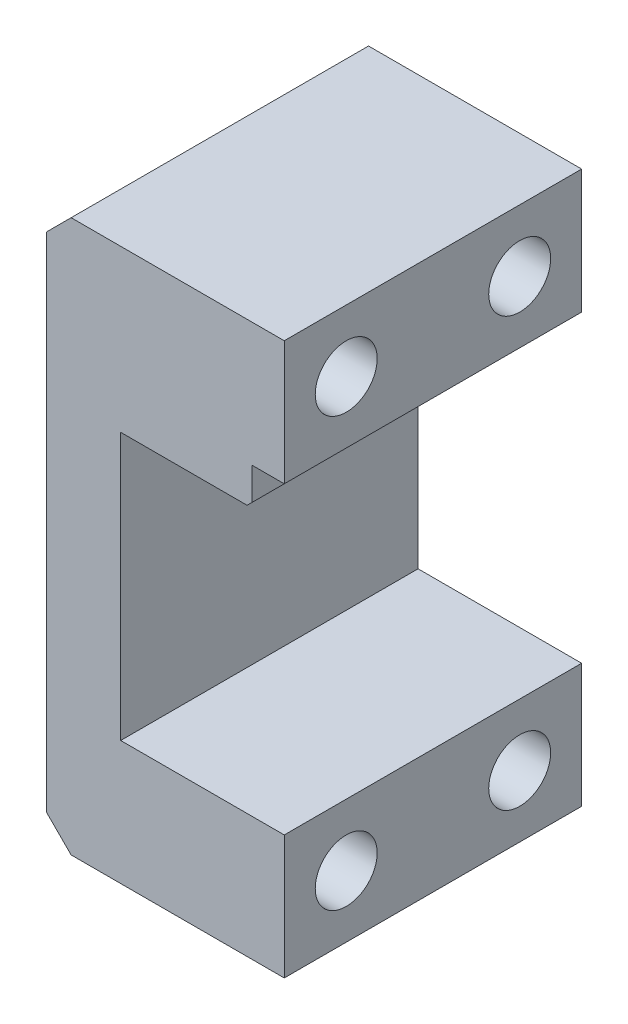
ISO-10303-21;
HEADER;
FILE_DESCRIPTION(('STEP AP214'),'2;1');
FILE_NAME('part.step','',(''),(''),'','','');
FILE_SCHEMA(('AUTOMOTIVE_DESIGN { 1 0 10303 214 1 1 1 1 }'));
ENDSEC;
DATA;
#1=APPLICATION_CONTEXT('core data for automotive mechanical design processes');
#2=APPLICATION_PROTOCOL_DEFINITION('international standard','automotive_design',2000,#1);
#3=PRODUCT_CONTEXT('',#1,'mechanical');
#4=PRODUCT('Part','Part','',(#3));
#5=PRODUCT_RELATED_PRODUCT_CATEGORY('part','',(#4));
#6=PRODUCT_DEFINITION_FORMATION('','',#4);
#7=PRODUCT_DEFINITION_CONTEXT('part definition',#1,'design');
#8=PRODUCT_DEFINITION('design','',#6,#7);
#9=PRODUCT_DEFINITION_SHAPE('','',#8);
#10=(LENGTH_UNIT() NAMED_UNIT(*) SI_UNIT(.MILLI.,.METRE.));
#11=(NAMED_UNIT(*) PLANE_ANGLE_UNIT() SI_UNIT($,.RADIAN.));
#12=(NAMED_UNIT(*) SI_UNIT($,.STERADIAN.) SOLID_ANGLE_UNIT());
#13=UNCERTAINTY_MEASURE_WITH_UNIT(LENGTH_MEASURE(1.E-05),#10,'distance_accuracy_value','');
#14=(GEOMETRIC_REPRESENTATION_CONTEXT(3) GLOBAL_UNCERTAINTY_ASSIGNED_CONTEXT((#13)) GLOBAL_UNIT_ASSIGNED_CONTEXT((#10,
#11,#12)) REPRESENTATION_CONTEXT('',''));
#15=CARTESIAN_POINT('',(0.,0.,0.));
#16=DIRECTION('',(0.,0.,1.));
#17=DIRECTION('',(1.,0.,0.));
#18=AXIS2_PLACEMENT_3D('',#15,#16,#17);
#19=CARTESIAN_POINT('',(9.6,0.,12.));
#20=DIRECTION('',(0.,1.,0.));
#21=DIRECTION('',(-1.,0.,0.));
#22=AXIS2_PLACEMENT_3D('',#19,#20,#21);
#23=PLANE('',#22);
#24=DIRECTION('',(1.,0.,0.));
#25=VECTOR('',#24,1.);
#26=CARTESIAN_POINT('',(9.6,0.,12.));
#27=LINE('',#26,#25);
#28=CARTESIAN_POINT('',(1.,0.,12.));
#29=VERTEX_POINT('',#28);
#30=CARTESIAN_POINT('',(9.6,0.,12.));
#31=VERTEX_POINT('',#30);
#32=EDGE_CURVE('E132',#29,#31,#27,.T.);
#33=ORIENTED_EDGE('',*,*,#32,.F.);
#34=DIRECTION('',(0.,0.,-1.));
#35=VECTOR('',#34,1.);
#36=CARTESIAN_POINT('',(1.,0.,12.));
#37=LINE('',#36,#35);
#38=CARTESIAN_POINT('',(1.,0.,0.));
#39=VERTEX_POINT('',#38);
#40=EDGE_CURVE('E170',#29,#39,#37,.T.);
#41=ORIENTED_EDGE('',*,*,#40,.T.);
#42=DIRECTION('',(1.,0.,0.));
#43=VECTOR('',#42,1.);
#44=CARTESIAN_POINT('',(9.6,0.,0.));
#45=LINE('',#44,#43);
#46=CARTESIAN_POINT('',(9.6,0.,0.));
#47=VERTEX_POINT('',#46);
#48=EDGE_CURVE('E154',#39,#47,#45,.T.);
#49=ORIENTED_EDGE('',*,*,#48,.T.);
#50=DIRECTION('',(0.,0.,-1.));
#51=VECTOR('',#50,1.);
#52=CARTESIAN_POINT('',(9.6,0.,12.));
#53=LINE('',#52,#51);
#54=EDGE_CURVE('E147',#31,#47,#53,.T.);
#55=ORIENTED_EDGE('',*,*,#54,.F.);
#56=EDGE_LOOP('',(#33,#41,#49,#55));
#57=FACE_BOUND('',#56,.T.);
#58=ADVANCED_FACE('F36',(#57),#23,.F.);
#59=CARTESIAN_POINT('',(9.6,5.,12.));
#60=DIRECTION('',(-1.,0.,0.));
#61=DIRECTION('',(0.,0.,1.));
#62=AXIS2_PLACEMENT_3D('',#59,#60,#61);
#63=PLANE('',#62);
#64=CARTESIAN_POINT('',(9.6,2.5,2.50000000000001));
#65=DIRECTION('',(-1.,0.,0.));
#66=DIRECTION('',(0.,0.,1.));
#67=AXIS2_PLACEMENT_3D('',#64,#65,#66);
#68=CIRCLE('',#67,1.25);
#69=CARTESIAN_POINT('',(9.6,2.5,3.75));
#70=VERTEX_POINT('',#69);
#71=EDGE_CURVE('E329',#70,#70,#68,.T.);
#72=ORIENTED_EDGE('',*,*,#71,.T.);
#73=EDGE_LOOP('',(#72));
#74=FACE_BOUND('',#73,.T.);
#75=CARTESIAN_POINT('',(9.6,2.5,9.5));
#76=DIRECTION('',(-1.,0.,0.));
#77=DIRECTION('',(0.,0.,1.));
#78=AXIS2_PLACEMENT_3D('',#75,#76,#77);
#79=CIRCLE('',#78,1.25);
#80=CARTESIAN_POINT('',(9.6,2.5,10.75));
#81=VERTEX_POINT('',#80);
#82=EDGE_CURVE('E339',#81,#81,#79,.T.);
#83=ORIENTED_EDGE('',*,*,#82,.T.);
#84=EDGE_LOOP('',(#83));
#85=FACE_BOUND('',#84,.T.);
#86=DIRECTION('',(0.,1.,0.));
#87=VECTOR('',#86,1.);
#88=CARTESIAN_POINT('',(9.6,5.,0.));
#89=LINE('',#88,#87);
#90=CARTESIAN_POINT('',(9.6,5.,0.));
#91=VERTEX_POINT('',#90);
#92=EDGE_CURVE('E232',#47,#91,#89,.T.);
#93=ORIENTED_EDGE('',*,*,#92,.T.);
#94=DIRECTION('',(0.,0.,-1.));
#95=VECTOR('',#94,1.);
#96=CARTESIAN_POINT('',(9.6,5.,12.));
#97=LINE('',#96,#95);
#98=CARTESIAN_POINT('',(9.6,5.,12.));
#99=VERTEX_POINT('',#98);
#100=EDGE_CURVE('E149',#99,#91,#97,.T.);
#101=ORIENTED_EDGE('',*,*,#100,.F.);
#102=DIRECTION('',(0.,1.,0.));
#103=VECTOR('',#102,1.);
#104=CARTESIAN_POINT('',(9.6,5.,12.));
#105=LINE('',#104,#103);
#106=EDGE_CURVE('E135',#31,#99,#105,.T.);
#107=ORIENTED_EDGE('',*,*,#106,.F.);
#108=ORIENTED_EDGE('',*,*,#54,.T.);
#109=EDGE_LOOP('',(#93,#101,#107,#108));
#110=FACE_BOUND('',#109,.T.);
#111=ADVANCED_FACE('F146',(#74,#85,#110),#63,.F.);
#112=CARTESIAN_POINT('',(3.,5.,12.));
#113=DIRECTION('',(0.,-1.,0.));
#114=DIRECTION('',(1.,0.,0.));
#115=AXIS2_PLACEMENT_3D('',#112,#113,#114);
#116=PLANE('',#115);
#117=DIRECTION('',(-1.,0.,0.));
#118=VECTOR('',#117,1.);
#119=CARTESIAN_POINT('',(3.,5.,0.));
#120=LINE('',#119,#118);
#121=CARTESIAN_POINT('',(3.,5.,0.));
#122=VERTEX_POINT('',#121);
#123=EDGE_CURVE('E226',#91,#122,#120,.T.);
#124=ORIENTED_EDGE('',*,*,#123,.T.);
#125=DIRECTION('',(0.,0.,-1.));
#126=VECTOR('',#125,1.);
#127=CARTESIAN_POINT('',(3.,5.,12.));
#128=LINE('',#127,#126);
#129=CARTESIAN_POINT('',(3.,5.,12.));
#130=VERTEX_POINT('',#129);
#131=EDGE_CURVE('E161',#130,#122,#128,.T.);
#132=ORIENTED_EDGE('',*,*,#131,.F.);
#133=DIRECTION('',(-1.,0.,0.));
#134=VECTOR('',#133,1.);
#135=CARTESIAN_POINT('',(3.,5.,12.));
#136=LINE('',#135,#134);
#137=EDGE_CURVE('E151',#99,#130,#136,.T.);
#138=ORIENTED_EDGE('',*,*,#137,.F.);
#139=ORIENTED_EDGE('',*,*,#100,.T.);
#140=EDGE_LOOP('',(#124,#132,#138,#139));
#141=FACE_BOUND('',#140,.T.);
#142=ADVANCED_FACE('F255',(#141),#116,.F.);
#143=CARTESIAN_POINT('',(3.,15.77,12.));
#144=DIRECTION('',(-1.,0.,0.));
#145=DIRECTION('',(0.,-1.,0.));
#146=AXIS2_PLACEMENT_3D('',#143,#144,#145);
#147=PLANE('',#146);
#148=DIRECTION('',(0.,1.,0.));
#149=VECTOR('',#148,1.);
#150=CARTESIAN_POINT('',(3.,15.77,0.));
#151=LINE('',#150,#149);
#152=CARTESIAN_POINT('',(3.,15.77,0.));
#153=VERTEX_POINT('',#152);
#154=EDGE_CURVE('E221',#122,#153,#151,.T.);
#155=ORIENTED_EDGE('',*,*,#154,.T.);
#156=DIRECTION('',(0.,0.,-1.));
#157=VECTOR('',#156,1.);
#158=CARTESIAN_POINT('',(3.,15.77,12.));
#159=LINE('',#158,#157);
#160=CARTESIAN_POINT('',(3.,15.77,12.));
#161=VERTEX_POINT('',#160);
#162=EDGE_CURVE('E212',#161,#153,#159,.T.);
#163=ORIENTED_EDGE('',*,*,#162,.F.);
#164=DIRECTION('',(0.,1.,0.));
#165=VECTOR('',#164,1.);
#166=CARTESIAN_POINT('',(3.,15.77,12.));
#167=LINE('',#166,#165);
#168=EDGE_CURVE('E222',#130,#161,#167,.T.);
#169=ORIENTED_EDGE('',*,*,#168,.F.);
#170=ORIENTED_EDGE('',*,*,#131,.T.);
#171=EDGE_LOOP('',(#155,#163,#169,#170));
#172=FACE_BOUND('',#171,.T.);
#173=ADVANCED_FACE('F219',(#172),#147,.F.);
#174=CARTESIAN_POINT('',(8.3,15.77,12.));
#175=DIRECTION('',(0.,1.,0.));
#176=DIRECTION('',(0.,0.,1.));
#177=AXIS2_PLACEMENT_3D('',#174,#175,#176);
#178=PLANE('',#177);
#179=DIRECTION('',(1.,0.,0.));
#180=VECTOR('',#179,1.);
#181=CARTESIAN_POINT('',(8.3,15.77,0.));
#182=LINE('',#181,#180);
#183=CARTESIAN_POINT('',(8.1,15.77,0.));
#184=VERTEX_POINT('',#183);
#185=EDGE_CURVE('E228',#153,#184,#182,.T.);
#186=ORIENTED_EDGE('',*,*,#185,.T.);
#187=DIRECTION('',(0.,0.,1.));
#188=VECTOR('',#187,1.);
#189=CARTESIAN_POINT('',(8.1,15.77,12.));
#190=LINE('',#189,#188);
#191=CARTESIAN_POINT('',(8.1,15.77,12.));
#192=VERTEX_POINT('',#191);
#193=EDGE_CURVE('E166',#184,#192,#190,.T.);
#194=ORIENTED_EDGE('',*,*,#193,.T.);
#195=DIRECTION('',(1.,0.,0.));
#196=VECTOR('',#195,1.);
#197=CARTESIAN_POINT('',(8.3,15.77,12.));
#198=LINE('',#197,#196);
#199=EDGE_CURVE('E257',#161,#192,#198,.T.);
#200=ORIENTED_EDGE('',*,*,#199,.F.);
#201=ORIENTED_EDGE('',*,*,#162,.T.);
#202=EDGE_LOOP('',(#186,#194,#200,#201));
#203=FACE_BOUND('',#202,.T.);
#204=ADVANCED_FACE('F269',(#203),#178,.F.);
#205=CARTESIAN_POINT('',(8.3,17.27,12.));
#206=DIRECTION('',(-1.,0.,0.));
#207=DIRECTION('',(0.,-1.,0.));
#208=AXIS2_PLACEMENT_3D('',#205,#206,#207);
#209=PLANE('',#208);
#210=DIRECTION('',(0.,1.,0.));
#211=VECTOR('',#210,1.);
#212=CARTESIAN_POINT('',(8.3,17.27,12.));
#213=LINE('',#212,#211);
#214=CARTESIAN_POINT('',(8.3,15.97,12.));
#215=VERTEX_POINT('',#214);
#216=CARTESIAN_POINT('',(8.3,17.27,12.));
#217=VERTEX_POINT('',#216);
#218=EDGE_CURVE('E250',#215,#217,#213,.T.);
#219=ORIENTED_EDGE('',*,*,#218,.F.);
#220=DIRECTION('',(0.,0.,-1.));
#221=VECTOR('',#220,1.);
#222=CARTESIAN_POINT('',(8.3,15.97,12.));
#223=LINE('',#222,#221);
#224=CARTESIAN_POINT('',(8.3,15.97,0.));
#225=VERTEX_POINT('',#224);
#226=EDGE_CURVE('E156',#215,#225,#223,.T.);
#227=ORIENTED_EDGE('',*,*,#226,.T.);
#228=DIRECTION('',(0.,1.,0.));
#229=VECTOR('',#228,1.);
#230=CARTESIAN_POINT('',(8.3,17.27,0.));
#231=LINE('',#230,#229);
#232=CARTESIAN_POINT('',(8.3,17.27,0.));
#233=VERTEX_POINT('',#232);
#234=EDGE_CURVE('E230',#225,#233,#231,.T.);
#235=ORIENTED_EDGE('',*,*,#234,.T.);
#236=DIRECTION('',(0.,0.,-1.));
#237=VECTOR('',#236,1.);
#238=CARTESIAN_POINT('',(8.3,17.27,12.));
#239=LINE('',#238,#237);
#240=EDGE_CURVE('E209',#217,#233,#239,.T.);
#241=ORIENTED_EDGE('',*,*,#240,.F.);
#242=EDGE_LOOP('',(#219,#227,#235,#241));
#243=FACE_BOUND('',#242,.T.);
#244=ADVANCED_FACE('F265',(#243),#209,.F.);
#245=CARTESIAN_POINT('',(9.6,17.27,12.));
#246=DIRECTION('',(0.,1.,0.));
#247=DIRECTION('',(0.,0.,1.));
#248=AXIS2_PLACEMENT_3D('',#245,#246,#247);
#249=PLANE('',#248);
#250=DIRECTION('',(1.,0.,0.));
#251=VECTOR('',#250,1.);
#252=CARTESIAN_POINT('',(9.6,17.27,0.));
#253=LINE('',#252,#251);
#254=CARTESIAN_POINT('',(9.6,17.27,0.));
#255=VERTEX_POINT('',#254);
#256=EDGE_CURVE('E201',#233,#255,#253,.T.);
#257=ORIENTED_EDGE('',*,*,#256,.T.);
#258=DIRECTION('',(0.,0.,-1.));
#259=VECTOR('',#258,1.);
#260=CARTESIAN_POINT('',(9.6,17.27,12.));
#261=LINE('',#260,#259);
#262=CARTESIAN_POINT('',(9.6,17.27,12.));
#263=VERTEX_POINT('',#262);
#264=EDGE_CURVE('E206',#263,#255,#261,.T.);
#265=ORIENTED_EDGE('',*,*,#264,.F.);
#266=DIRECTION('',(1.,0.,0.));
#267=VECTOR('',#266,1.);
#268=CARTESIAN_POINT('',(9.6,17.27,12.));
#269=LINE('',#268,#267);
#270=EDGE_CURVE('E247',#217,#263,#269,.T.);
#271=ORIENTED_EDGE('',*,*,#270,.F.);
#272=ORIENTED_EDGE('',*,*,#240,.T.);
#273=EDGE_LOOP('',(#257,#265,#271,#272));
#274=FACE_BOUND('',#273,.T.);
#275=ADVANCED_FACE('F239',(#274),#249,.F.);
#276=CARTESIAN_POINT('',(9.6,22.27,12.));
#277=DIRECTION('',(-1.,0.,0.));
#278=DIRECTION('',(0.,-1.,0.));
#279=AXIS2_PLACEMENT_3D('',#276,#277,#278);
#280=PLANE('',#279);
#281=CARTESIAN_POINT('',(9.6,19.77,9.5));
#282=DIRECTION('',(-1.,0.,0.));
#283=DIRECTION('',(0.,0.,1.));
#284=AXIS2_PLACEMENT_3D('',#281,#282,#283);
#285=CIRCLE('',#284,1.25);
#286=CARTESIAN_POINT('',(9.6,19.77,10.75));
#287=VERTEX_POINT('',#286);
#288=EDGE_CURVE('E345',#287,#287,#285,.T.);
#289=ORIENTED_EDGE('',*,*,#288,.T.);
#290=EDGE_LOOP('',(#289));
#291=FACE_BOUND('',#290,.T.);
#292=CARTESIAN_POINT('',(9.6,19.77,2.5));
#293=DIRECTION('',(-1.,0.,0.));
#294=DIRECTION('',(0.,0.,1.));
#295=AXIS2_PLACEMENT_3D('',#292,#293,#294);
#296=CIRCLE('',#295,1.25);
#297=CARTESIAN_POINT('',(9.6,19.77,3.75));
#298=VERTEX_POINT('',#297);
#299=EDGE_CURVE('E254',#298,#298,#296,.T.);
#300=ORIENTED_EDGE('',*,*,#299,.T.);
#301=EDGE_LOOP('',(#300));
#302=FACE_BOUND('',#301,.T.);
#303=DIRECTION('',(0.,1.,0.));
#304=VECTOR('',#303,1.);
#305=CARTESIAN_POINT('',(9.6,22.27,0.));
#306=LINE('',#305,#304);
#307=CARTESIAN_POINT('',(9.6,22.27,0.));
#308=VERTEX_POINT('',#307);
#309=EDGE_CURVE('E198',#255,#308,#306,.T.);
#310=ORIENTED_EDGE('',*,*,#309,.T.);
#311=DIRECTION('',(0.,0.,-1.));
#312=VECTOR('',#311,1.);
#313=CARTESIAN_POINT('',(9.6,22.27,12.));
#314=LINE('',#313,#312);
#315=CARTESIAN_POINT('',(9.6,22.27,12.));
#316=VERTEX_POINT('',#315);
#317=EDGE_CURVE('E188',#316,#308,#314,.T.);
#318=ORIENTED_EDGE('',*,*,#317,.F.);
#319=DIRECTION('',(0.,1.,0.));
#320=VECTOR('',#319,1.);
#321=CARTESIAN_POINT('',(9.6,22.27,12.));
#322=LINE('',#321,#320);
#323=EDGE_CURVE('E246',#263,#316,#322,.T.);
#324=ORIENTED_EDGE('',*,*,#323,.F.);
#325=ORIENTED_EDGE('',*,*,#264,.T.);
#326=EDGE_LOOP('',(#310,#318,#324,#325));
#327=FACE_BOUND('',#326,.T.);
#328=ADVANCED_FACE('F245',(#291,#302,#327),#280,.F.);
#329=CARTESIAN_POINT('',(0.,22.27,12.));
#330=DIRECTION('',(0.,-1.,0.));
#331=DIRECTION('',(0.,0.,-1.));
#332=AXIS2_PLACEMENT_3D('',#329,#330,#331);
#333=PLANE('',#332);
#334=DIRECTION('',(-1.,0.,0.));
#335=VECTOR('',#334,1.);
#336=CARTESIAN_POINT('',(0.,22.27,0.));
#337=LINE('',#336,#335);
#338=CARTESIAN_POINT('',(1.,22.27,0.));
#339=VERTEX_POINT('',#338);
#340=EDGE_CURVE('E194',#308,#339,#337,.T.);
#341=ORIENTED_EDGE('',*,*,#340,.T.);
#342=DIRECTION('',(0.,0.,1.));
#343=VECTOR('',#342,1.);
#344=CARTESIAN_POINT('',(1.,22.27,12.));
#345=LINE('',#344,#343);
#346=CARTESIAN_POINT('',(1.,22.27,12.));
#347=VERTEX_POINT('',#346);
#348=EDGE_CURVE('E11',#339,#347,#345,.T.);
#349=ORIENTED_EDGE('',*,*,#348,.T.);
#350=DIRECTION('',(-1.,0.,0.));
#351=VECTOR('',#350,1.);
#352=CARTESIAN_POINT('',(0.,22.27,12.));
#353=LINE('',#352,#351);
#354=EDGE_CURVE('E183',#316,#347,#353,.T.);
#355=ORIENTED_EDGE('',*,*,#354,.F.);
#356=ORIENTED_EDGE('',*,*,#317,.T.);
#357=EDGE_LOOP('',(#341,#349,#355,#356));
#358=FACE_BOUND('',#357,.T.);
#359=ADVANCED_FACE('F196',(#358),#333,.F.);
#360=CARTESIAN_POINT('',(0.,0.,12.));
#361=DIRECTION('',(1.,0.,0.));
#362=DIRECTION('',(0.,0.,-1.));
#363=AXIS2_PLACEMENT_3D('',#360,#361,#362);
#364=PLANE('',#363);
#365=CARTESIAN_POINT('',(0.,2.5,2.50000000000001));
#366=DIRECTION('',(-1.,0.,0.));
#367=DIRECTION('',(0.,0.,1.));
#368=AXIS2_PLACEMENT_3D('',#365,#366,#367);
#369=CIRCLE('',#368,1.25);
#370=CARTESIAN_POINT('',(0.,2.5,3.75000000000001));
#371=VERTEX_POINT('',#370);
#372=EDGE_CURVE('E332',#371,#371,#369,.T.);
#373=ORIENTED_EDGE('',*,*,#372,.F.);
#374=EDGE_LOOP('',(#373));
#375=FACE_BOUND('',#374,.T.);
#376=CARTESIAN_POINT('',(0.,2.5,9.5));
#377=DIRECTION('',(-1.,0.,0.));
#378=DIRECTION('',(0.,0.,1.));
#379=AXIS2_PLACEMENT_3D('',#376,#377,#378);
#380=CIRCLE('',#379,1.25);
#381=CARTESIAN_POINT('',(0.,2.5,10.75));
#382=VERTEX_POINT('',#381);
#383=EDGE_CURVE('E334',#382,#382,#380,.T.);
#384=ORIENTED_EDGE('',*,*,#383,.F.);
#385=EDGE_LOOP('',(#384));
#386=FACE_BOUND('',#385,.T.);
#387=CARTESIAN_POINT('',(0.,19.77,9.5));
#388=DIRECTION('',(-1.,0.,0.));
#389=DIRECTION('',(0.,0.,1.));
#390=AXIS2_PLACEMENT_3D('',#387,#388,#389);
#391=CIRCLE('',#390,1.25);
#392=CARTESIAN_POINT('',(0.,19.77,10.75));
#393=VERTEX_POINT('',#392);
#394=EDGE_CURVE('E342',#393,#393,#391,.T.);
#395=ORIENTED_EDGE('',*,*,#394,.F.);
#396=EDGE_LOOP('',(#395));
#397=FACE_BOUND('',#396,.T.);
#398=CARTESIAN_POINT('',(0.,19.77,2.5));
#399=DIRECTION('',(-1.,0.,0.));
#400=DIRECTION('',(0.,0.,1.));
#401=AXIS2_PLACEMENT_3D('',#398,#399,#400);
#402=CIRCLE('',#401,1.25);
#403=CARTESIAN_POINT('',(0.,19.77,3.75));
#404=VERTEX_POINT('',#403);
#405=EDGE_CURVE('E348',#404,#404,#402,.T.);
#406=ORIENTED_EDGE('',*,*,#405,.F.);
#407=EDGE_LOOP('',(#406));
#408=FACE_BOUND('',#407,.T.);
#409=DIRECTION('',(0.,-1.,0.));
#410=VECTOR('',#409,1.);
#411=CARTESIAN_POINT('',(0.,0.,0.));
#412=LINE('',#411,#410);
#413=CARTESIAN_POINT('',(0.,21.27,0.));
#414=VERTEX_POINT('',#413);
#415=CARTESIAN_POINT('',(0.,1.,0.));
#416=VERTEX_POINT('',#415);
#417=EDGE_CURVE('E142',#414,#416,#412,.T.);
#418=ORIENTED_EDGE('',*,*,#417,.T.);
#419=DIRECTION('',(0.,0.,1.));
#420=VECTOR('',#419,1.);
#421=CARTESIAN_POINT('',(0.,1.,12.));
#422=LINE('',#421,#420);
#423=CARTESIAN_POINT('',(0.,1.,12.));
#424=VERTEX_POINT('',#423);
#425=EDGE_CURVE('E57',#416,#424,#422,.T.);
#426=ORIENTED_EDGE('',*,*,#425,.T.);
#427=DIRECTION('',(0.,-1.,0.));
#428=VECTOR('',#427,1.);
#429=CARTESIAN_POINT('',(0.,0.,12.));
#430=LINE('',#429,#428);
#431=CARTESIAN_POINT('',(0.,21.27,12.));
#432=VERTEX_POINT('',#431);
#433=EDGE_CURVE('E182',#432,#424,#430,.T.);
#434=ORIENTED_EDGE('',*,*,#433,.F.);
#435=DIRECTION('',(0.,0.,-1.));
#436=VECTOR('',#435,1.);
#437=CARTESIAN_POINT('',(0.,21.27,12.));
#438=LINE('',#437,#436);
#439=EDGE_CURVE('E176',#432,#414,#438,.T.);
#440=ORIENTED_EDGE('',*,*,#439,.T.);
#441=EDGE_LOOP('',(#418,#426,#434,#440));
#442=FACE_BOUND('',#441,.T.);
#443=ADVANCED_FACE('F186',(#375,#386,#397,#408,#442),#364,.F.);
#444=CARTESIAN_POINT('',(0.,0.,12.));
#445=DIRECTION('',(0.,0.,-1.));
#446=DIRECTION('',(-1.,0.,0.));
#447=AXIS2_PLACEMENT_3D('',#444,#445,#446);
#448=PLANE('',#447);
#449=ORIENTED_EDGE('',*,*,#433,.T.);
#450=DIRECTION('',(-0.707106781186546,0.707106781186549,0.));
#451=VECTOR('',#450,1.);
#452=CARTESIAN_POINT('',(1.,0.,12.));
#453=LINE('',#452,#451);
#454=EDGE_CURVE('E44',#424,#29,#453,.F.);
#455=ORIENTED_EDGE('',*,*,#454,.T.);
#456=ORIENTED_EDGE('',*,*,#32,.T.);
#457=ORIENTED_EDGE('',*,*,#106,.T.);
#458=ORIENTED_EDGE('',*,*,#137,.T.);
#459=ORIENTED_EDGE('',*,*,#168,.T.);
#460=ORIENTED_EDGE('',*,*,#199,.T.);
#461=DIRECTION('',(-0.707106781186548,-0.707106781186548,0.));
#462=VECTOR('',#461,1.);
#463=CARTESIAN_POINT('',(8.3,15.97,12.));
#464=LINE('',#463,#462);
#465=EDGE_CURVE('E168',#192,#215,#464,.F.);
#466=ORIENTED_EDGE('',*,*,#465,.T.);
#467=ORIENTED_EDGE('',*,*,#218,.T.);
#468=ORIENTED_EDGE('',*,*,#270,.T.);
#469=ORIENTED_EDGE('',*,*,#323,.T.);
#470=ORIENTED_EDGE('',*,*,#354,.T.);
#471=DIRECTION('',(0.707106781186549,0.707106781186546,0.));
#472=VECTOR('',#471,1.);
#473=CARTESIAN_POINT('',(0.,21.27,12.));
#474=LINE('',#473,#472);
#475=EDGE_CURVE('E180',#347,#432,#474,.F.);
#476=ORIENTED_EDGE('',*,*,#475,.T.);
#477=EDGE_LOOP('',(#449,#455,#456,#457,#458,#459,#460,#466,#467,#468,#469,#470,#476));
#478=FACE_BOUND('',#477,.T.);
#479=ADVANCED_FACE('F134',(#478),#448,.F.);
#480=CARTESIAN_POINT('',(0.,0.,0.));
#481=DIRECTION('',(0.,0.,-1.));
#482=DIRECTION('',(-1.,0.,0.));
#483=AXIS2_PLACEMENT_3D('',#480,#481,#482);
#484=PLANE('',#483);
#485=ORIENTED_EDGE('',*,*,#48,.F.);
#486=DIRECTION('',(0.707106781186546,-0.707106781186549,0.));
#487=VECTOR('',#486,1.);
#488=CARTESIAN_POINT('',(0.500000000000002,0.500000000000001,0.));
#489=LINE('',#488,#487);
#490=EDGE_CURVE('E174',#39,#416,#489,.F.);
#491=ORIENTED_EDGE('',*,*,#490,.T.);
#492=ORIENTED_EDGE('',*,*,#417,.F.);
#493=DIRECTION('',(-0.707106781186549,-0.707106781186546,0.));
#494=VECTOR('',#493,1.);
#495=CARTESIAN_POINT('',(-10.635,10.635,0.));
#496=LINE('',#495,#494);
#497=EDGE_CURVE('E172',#414,#339,#496,.F.);
#498=ORIENTED_EDGE('',*,*,#497,.T.);
#499=ORIENTED_EDGE('',*,*,#340,.F.);
#500=ORIENTED_EDGE('',*,*,#309,.F.);
#501=ORIENTED_EDGE('',*,*,#256,.F.);
#502=ORIENTED_EDGE('',*,*,#234,.F.);
#503=DIRECTION('',(0.707106781186548,0.707106781186548,0.));
#504=VECTOR('',#503,1.);
#505=CARTESIAN_POINT('',(-3.835,3.835,0.));
#506=LINE('',#505,#504);
#507=EDGE_CURVE('E159',#225,#184,#506,.F.);
#508=ORIENTED_EDGE('',*,*,#507,.T.);
#509=ORIENTED_EDGE('',*,*,#185,.F.);
#510=ORIENTED_EDGE('',*,*,#154,.F.);
#511=ORIENTED_EDGE('',*,*,#123,.F.);
#512=ORIENTED_EDGE('',*,*,#92,.F.);
#513=EDGE_LOOP('',(#485,#491,#492,#498,#499,#500,#501,#502,#508,#509,#510,#511,#512));
#514=FACE_BOUND('',#513,.T.);
#515=ADVANCED_FACE('F192',(#514),#484,.T.);
#516=CARTESIAN_POINT('',(8.3,15.97,12.));
#517=DIRECTION('',(-0.707106781186548,0.707106781186548,0.));
#518=DIRECTION('',(0.,0.,-1.));
#519=AXIS2_PLACEMENT_3D('',#516,#517,#518);
#520=PLANE('',#519);
#521=ORIENTED_EDGE('',*,*,#465,.F.);
#522=ORIENTED_EDGE('',*,*,#193,.F.);
#523=ORIENTED_EDGE('',*,*,#507,.F.);
#524=ORIENTED_EDGE('',*,*,#226,.F.);
#525=EDGE_LOOP('',(#521,#522,#523,#524));
#526=FACE_BOUND('',#525,.T.);
#527=ADVANCED_FACE('F271',(#526),#520,.F.);
#528=CARTESIAN_POINT('',(0.,19.77,2.5));
#529=DIRECTION('',(-1.,0.,0.));
#530=DIRECTION('',(0.,0.,1.));
#531=AXIS2_PLACEMENT_3D('',#528,#529,#530);
#532=CYLINDRICAL_SURFACE('',#531,1.25);
#533=ORIENTED_EDGE('',*,*,#299,.F.);
#534=EDGE_LOOP('',(#533));
#535=FACE_BOUND('',#534,.T.);
#536=ORIENTED_EDGE('',*,*,#405,.T.);
#537=EDGE_LOOP('',(#536));
#538=FACE_BOUND('',#537,.T.);
#539=ADVANCED_FACE('F273',(#535,#538),#532,.F.);
#540=CARTESIAN_POINT('',(0.,19.77,9.5));
#541=DIRECTION('',(-1.,0.,0.));
#542=DIRECTION('',(0.,0.,1.));
#543=AXIS2_PLACEMENT_3D('',#540,#541,#542);
#544=CYLINDRICAL_SURFACE('',#543,1.25);
#545=ORIENTED_EDGE('',*,*,#288,.F.);
#546=EDGE_LOOP('',(#545));
#547=FACE_BOUND('',#546,.T.);
#548=ORIENTED_EDGE('',*,*,#394,.T.);
#549=EDGE_LOOP('',(#548));
#550=FACE_BOUND('',#549,.T.);
#551=ADVANCED_FACE('F279',(#547,#550),#544,.F.);
#552=CARTESIAN_POINT('',(0.,2.5,9.5));
#553=DIRECTION('',(-1.,0.,0.));
#554=DIRECTION('',(0.,0.,1.));
#555=AXIS2_PLACEMENT_3D('',#552,#553,#554);
#556=CYLINDRICAL_SURFACE('',#555,1.25);
#557=ORIENTED_EDGE('',*,*,#82,.F.);
#558=EDGE_LOOP('',(#557));
#559=FACE_BOUND('',#558,.T.);
#560=ORIENTED_EDGE('',*,*,#383,.T.);
#561=EDGE_LOOP('',(#560));
#562=FACE_BOUND('',#561,.T.);
#563=ADVANCED_FACE('F313',(#559,#562),#556,.F.);
#564=CARTESIAN_POINT('',(0.,2.5,2.50000000000001));
#565=DIRECTION('',(-1.,0.,0.));
#566=DIRECTION('',(0.,0.,1.));
#567=AXIS2_PLACEMENT_3D('',#564,#565,#566);
#568=CYLINDRICAL_SURFACE('',#567,1.25);
#569=ORIENTED_EDGE('',*,*,#71,.F.);
#570=EDGE_LOOP('',(#569));
#571=FACE_BOUND('',#570,.T.);
#572=ORIENTED_EDGE('',*,*,#372,.T.);
#573=EDGE_LOOP('',(#572));
#574=FACE_BOUND('',#573,.T.);
#575=ADVANCED_FACE('F317',(#571,#574),#568,.F.);
#576=CARTESIAN_POINT('',(1.,0.,12.));
#577=DIRECTION('',(0.707106781186549,0.707106781186546,0.));
#578=DIRECTION('',(0.,0.,-1.));
#579=AXIS2_PLACEMENT_3D('',#576,#577,#578);
#580=PLANE('',#579);
#581=ORIENTED_EDGE('',*,*,#454,.F.);
#582=ORIENTED_EDGE('',*,*,#425,.F.);
#583=ORIENTED_EDGE('',*,*,#490,.F.);
#584=ORIENTED_EDGE('',*,*,#40,.F.);
#585=EDGE_LOOP('',(#581,#582,#583,#584));
#586=FACE_BOUND('',#585,.T.);
#587=ADVANCED_FACE('F320',(#586),#580,.F.);
#588=CARTESIAN_POINT('',(0.,21.27,12.));
#589=DIRECTION('',(0.707106781186546,-0.707106781186549,0.));
#590=DIRECTION('',(0.,0.,-1.));
#591=AXIS2_PLACEMENT_3D('',#588,#589,#590);
#592=PLANE('',#591);
#593=ORIENTED_EDGE('',*,*,#475,.F.);
#594=ORIENTED_EDGE('',*,*,#348,.F.);
#595=ORIENTED_EDGE('',*,*,#497,.F.);
#596=ORIENTED_EDGE('',*,*,#439,.F.);
#597=EDGE_LOOP('',(#593,#594,#595,#596));
#598=FACE_BOUND('',#597,.T.);
#599=ADVANCED_FACE('F38',(#598),#592,.F.);
#600=CLOSED_SHELL('',(#58,#111,#142,#173,#204,#244,#275,#328,#359,#443,#479,#515,#527,#539,#551,
#563,#575,#587,#599));
#601=MANIFOLD_SOLID_BREP('B2',#600);
#602=ADVANCED_BREP_SHAPE_REPRESENTATION('',(#18,#601),#14);
#603=SHAPE_DEFINITION_REPRESENTATION(#9,#602);
ENDSEC;
END-ISO-10303-21;
